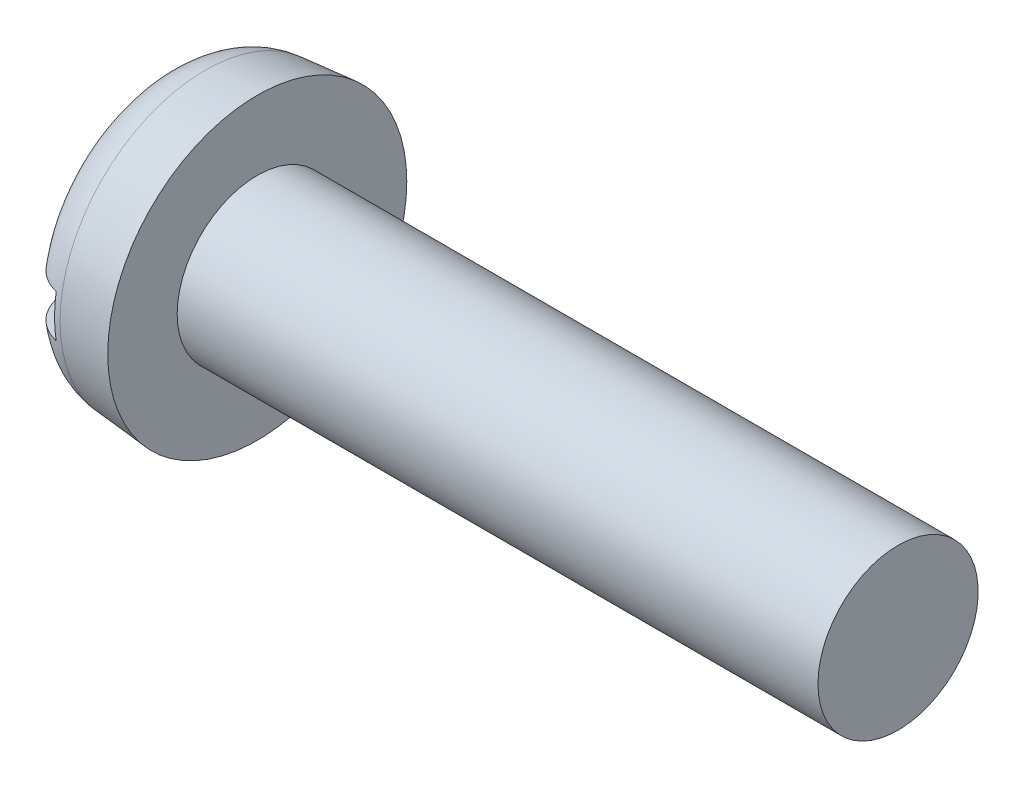
ISO-10303-21;
HEADER;
FILE_DESCRIPTION(('STEP AP214'),'2;1');
FILE_NAME('part.step','',(''),(''),'','','');
FILE_SCHEMA(('AUTOMOTIVE_DESIGN { 1 0 10303 214 1 1 1 1 }'));
ENDSEC;
DATA;
#1=APPLICATION_CONTEXT('core data for automotive mechanical design processes');
#2=APPLICATION_PROTOCOL_DEFINITION('international standard','automotive_design',2000,#1);
#3=PRODUCT_CONTEXT('',#1,'mechanical');
#4=PRODUCT('Part','Part','',(#3));
#5=PRODUCT_RELATED_PRODUCT_CATEGORY('part','',(#4));
#6=PRODUCT_DEFINITION_FORMATION('','',#4);
#7=PRODUCT_DEFINITION_CONTEXT('part definition',#1,'design');
#8=PRODUCT_DEFINITION('design','',#6,#7);
#9=PRODUCT_DEFINITION_SHAPE('','',#8);
#10=(LENGTH_UNIT() NAMED_UNIT(*) SI_UNIT(.MILLI.,.METRE.));
#11=(NAMED_UNIT(*) PLANE_ANGLE_UNIT() SI_UNIT($,.RADIAN.));
#12=(NAMED_UNIT(*) SI_UNIT($,.STERADIAN.) SOLID_ANGLE_UNIT());
#13=UNCERTAINTY_MEASURE_WITH_UNIT(LENGTH_MEASURE(1.E-05),#10,'distance_accuracy_value','');
#14=(GEOMETRIC_REPRESENTATION_CONTEXT(3) GLOBAL_UNCERTAINTY_ASSIGNED_CONTEXT((#13)) GLOBAL_UNIT_ASSIGNED_CONTEXT((#10,
#11,#12)) REPRESENTATION_CONTEXT('',''));
#15=CARTESIAN_POINT('',(0.,0.,0.));
#16=DIRECTION('',(0.,0.,1.));
#17=DIRECTION('',(1.,0.,0.));
#18=AXIS2_PLACEMENT_3D('',#15,#16,#17);
#19=CARTESIAN_POINT('',(0.,0.,0.));
#20=DIRECTION('',(-1.,0.,0.));
#21=DIRECTION('',(0.,0.,1.));
#22=AXIS2_PLACEMENT_3D('',#19,#20,#21);
#23=PLANE('',#22);
#24=DIRECTION('',(0.,0.,-1.));
#25=VECTOR('',#24,1.);
#26=CARTESIAN_POINT('',(0.,0.4,2.8));
#27=LINE('',#26,#25);
#28=CARTESIAN_POINT('',(0.,0.4,1.77326763142532));
#29=VERTEX_POINT('',#28);
#30=CARTESIAN_POINT('',(0.,0.4,-1.77326763142532));
#31=VERTEX_POINT('',#30);
#32=EDGE_CURVE('E88',#29,#31,#27,.T.);
#33=ORIENTED_EDGE('',*,*,#32,.F.);
#34=CARTESIAN_POINT('',(0.,0.,0.));
#35=DIRECTION('',(-1.,0.,0.));
#36=DIRECTION('',(0.,0.,1.));
#37=AXIS2_PLACEMENT_3D('',#34,#35,#36);
#38=CIRCLE('',#37,1.81782234903766);
#39=EDGE_CURVE('E94',#29,#31,#38,.T.);
#40=ORIENTED_EDGE('',*,*,#39,.T.);
#41=EDGE_LOOP('',(#33,#40));
#42=FACE_BOUND('',#41,.T.);
#43=ADVANCED_FACE('F35',(#42),#23,.T.);
#44=CARTESIAN_POINT('',(-25.4,0.,0.));
#45=DIRECTION('',(-1.,0.,0.));
#46=DIRECTION('',(0.,0.,1.));
#47=AXIS2_PLACEMENT_3D('',#44,#45,#46);
#48=CYLINDRICAL_SURFACE('',#47,1.5);
#49=CARTESIAN_POINT('',(13.8,0.,0.));
#50=DIRECTION('',(-1.,0.,0.));
#51=DIRECTION('',(0.,0.,1.));
#52=AXIS2_PLACEMENT_3D('',#49,#50,#51);
#53=CIRCLE('',#52,1.5);
#54=CARTESIAN_POINT('',(13.8,0.,1.5));
#55=VERTEX_POINT('',#54);
#56=EDGE_CURVE('E95',#55,#55,#53,.T.);
#57=ORIENTED_EDGE('',*,*,#56,.T.);
#58=EDGE_LOOP('',(#57));
#59=FACE_BOUND('',#58,.T.);
#60=CARTESIAN_POINT('',(1.8,0.,0.));
#61=DIRECTION('',(-1.,0.,0.));
#62=DIRECTION('',(0.,0.,1.));
#63=AXIS2_PLACEMENT_3D('',#60,#61,#62);
#64=CIRCLE('',#63,1.5);
#65=CARTESIAN_POINT('',(1.8,0.,1.5));
#66=VERTEX_POINT('',#65);
#67=EDGE_CURVE('E152',#66,#66,#64,.T.);
#68=ORIENTED_EDGE('',*,*,#67,.F.);
#69=EDGE_LOOP('',(#68));
#70=FACE_BOUND('',#69,.T.);
#71=ADVANCED_FACE('F140',(#59,#70),#48,.T.);
#72=CARTESIAN_POINT('',(13.8,1.5,0.));
#73=DIRECTION('',(1.,0.,0.));
#74=DIRECTION('',(0.,0.,-1.));
#75=AXIS2_PLACEMENT_3D('',#72,#73,#74);
#76=PLANE('',#75);
#77=ORIENTED_EDGE('',*,*,#56,.F.);
#78=EDGE_LOOP('',(#77));
#79=FACE_BOUND('',#78,.T.);
#80=ADVANCED_FACE('F138',(#79),#76,.T.);
#81=DIRECTION('',(0.,0.,1.));
#82=VECTOR('',#81,1.);
#83=CARTESIAN_POINT('',(0.,-0.4,-2.8));
#84=LINE('',#83,#82);
#85=CARTESIAN_POINT('',(0.,-0.4,-1.77326763142532));
#86=VERTEX_POINT('',#85);
#87=CARTESIAN_POINT('',(0.,-0.4,1.77326763142532));
#88=VERTEX_POINT('',#87);
#89=EDGE_CURVE('E79',#86,#88,#84,.T.);
#90=ORIENTED_EDGE('',*,*,#89,.F.);
#91=EDGE_CURVE('E86',#86,#88,#38,.T.);
#92=ORIENTED_EDGE('',*,*,#91,.T.);
#93=EDGE_LOOP('',(#90,#92));
#94=FACE_BOUND('',#93,.T.);
#95=ADVANCED_FACE('F85',(#94),#23,.T.);
#96=CARTESIAN_POINT('',(0.,0.,0.));
#97=DIRECTION('',(1.,0.,0.));
#98=DIRECTION('',(0.,0.,-1.));
#99=AXIS2_PLACEMENT_3D('',#96,#97,#98);
#100=CONICAL_SURFACE('',#99,2.64252040565334,0.0872664625997168);
#101=CARTESIAN_POINT('',(0.821559831527111,0.,0.));
#102=DIRECTION('',(-1.,0.,0.));
#103=DIRECTION('',(0.,0.,1.));
#104=AXIS2_PLACEMENT_3D('',#101,#102,#103);
#105=CIRCLE('',#104,2.71439757732023);
#106=CARTESIAN_POINT('',(0.821559831527111,0.,2.71439757732023));
#107=VERTEX_POINT('',#106);
#108=EDGE_CURVE('E98',#107,#107,#105,.F.);
#109=ORIENTED_EDGE('',*,*,#108,.T.);
#110=EDGE_LOOP('',(#109));
#111=FACE_BOUND('',#110,.T.);
#112=CARTESIAN_POINT('',(1.8,0.,0.));
#113=DIRECTION('',(-1.,0.,0.));
#114=DIRECTION('',(0.,0.,1.));
#115=AXIS2_PLACEMENT_3D('',#112,#113,#114);
#116=CIRCLE('',#115,2.8);
#117=CARTESIAN_POINT('',(1.8,0.,2.8));
#118=VERTEX_POINT('',#117);
#119=EDGE_CURVE('E100',#118,#118,#116,.T.);
#120=ORIENTED_EDGE('',*,*,#119,.T.);
#121=EDGE_LOOP('',(#120));
#122=FACE_BOUND('',#121,.T.);
#123=ADVANCED_FACE('F131',(#111,#122),#100,.T.);
#124=CARTESIAN_POINT('',(1.8,1.5,0.));
#125=DIRECTION('',(-1.,0.,0.));
#126=DIRECTION('',(0.,0.,1.));
#127=AXIS2_PLACEMENT_3D('',#124,#125,#126);
#128=PLANE('',#127);
#129=ORIENTED_EDGE('',*,*,#119,.F.);
#130=EDGE_LOOP('',(#129));
#131=FACE_BOUND('',#130,.T.);
#132=ORIENTED_EDGE('',*,*,#67,.T.);
#133=EDGE_LOOP('',(#132));
#134=FACE_BOUND('',#133,.T.);
#135=ADVANCED_FACE('F127',(#131,#134),#128,.F.);
#136=CARTESIAN_POINT('',(0.9,0.,0.));
#137=DIRECTION('',(-1.,0.,0.));
#138=DIRECTION('',(0.,0.,1.));
#139=AXIS2_PLACEMENT_3D('',#136,#137,#138);
#140=TOROIDAL_SURFACE('',#139,1.81782234903766,0.9);
#141=CARTESIAN_POINT('',(0.401696093511728,0.4,-2.53593152114129));
#142=CARTESIAN_POINT('',(0.443301117774009,0.4,-2.56393332788218));
#143=CARTESIAN_POINT('',(0.48728921147468,0.4,-2.58845843023252));
#144=CARTESIAN_POINT('',(0.578792425576941,0.4,-2.62980192456992));
#145=CARTESIAN_POINT('',(0.626311517541325,0.4,-2.64661148109401));
#146=CARTESIAN_POINT('',(0.723491694345221,0.4,-2.67199528317045));
#147=CARTESIAN_POINT('',(0.77315217005018,0.4,-2.6805718547261));
#148=CARTESIAN_POINT('',(0.873195470603058,0.4,-2.68923740018578));
#149=CARTESIAN_POINT('',(0.923578118909892,0.4,-2.68932841422142));
#150=CARTESIAN_POINT('',(1.02350797374872,0.4,-2.68103738118982));
#151=CARTESIAN_POINT('',(1.07305702227845,0.4,-2.67267751789981));
#152=CARTESIAN_POINT('',(1.17005159771854,0.4,-2.64776531442094));
#153=CARTESIAN_POINT('',(1.21749706154432,0.4,-2.63121272872072));
#154=CARTESIAN_POINT('',(1.30899463227735,0.4,-2.59038229907007));
#155=CARTESIAN_POINT('',(1.35304326494453,0.4,-2.5660966726896));
#156=CARTESIAN_POINT('',(1.43646971838795,0.4,-2.51051742624853));
#157=CARTESIAN_POINT('',(1.47584746170715,0.4,-2.47922368999777));
#158=CARTESIAN_POINT('',(1.54908472891299,0.4,-2.41032419236434));
#159=CARTESIAN_POINT('',(1.58290894495081,0.4,-2.37268091273685));
#160=CARTESIAN_POINT('',(1.64384285536696,0.4,-2.29230689336045));
#161=CARTESIAN_POINT('',(1.67095227126419,0.4,-2.24957594272072));
#162=CARTESIAN_POINT('',(1.71804431058735,0.4,-2.15971237578418));
#163=CARTESIAN_POINT('',(1.73793948776457,0.4,-2.11253395536871));
#164=CARTESIAN_POINT('',(1.76968090770725,0.4,-2.01554593245493));
#165=CARTESIAN_POINT('',(1.78152655521718,0.4,-1.96573613566218));
#166=CARTESIAN_POINT('',(1.79707863209083,0.4,-1.86394560462762));
#167=CARTESIAN_POINT('',(1.80063474217523,0.4,-1.81194193297292));
#168=CARTESIAN_POINT('',(1.79917918253395,0.4,-1.70805700113295));
#169=CARTESIAN_POINT('',(1.79416652473772,0.4,-1.65617575575555));
#170=CARTESIAN_POINT('',(1.7755943642346,0.4,-1.55269446133053));
#171=CARTESIAN_POINT('',(1.76183474132893,0.4,-1.50113034177219));
#172=CARTESIAN_POINT('',(1.72605722331735,0.4,-1.40095096381718));
#173=CARTESIAN_POINT('',(1.70403814128862,0.4,-1.35233613041373));
#174=CARTESIAN_POINT('',(1.65177086981811,0.4,-1.25824022538735));
#175=CARTESIAN_POINT('',(1.62134113345016,0.4,-1.21285988807693));
#176=CARTESIAN_POINT('',(1.55331109595649,0.4,-1.12780932458797));
#177=CARTESIAN_POINT('',(1.51570875984687,0.4,-1.08814072454133));
#178=CARTESIAN_POINT('',(1.43418773757712,0.4,-1.01571120097083));
#179=CARTESIAN_POINT('',(1.39025557046043,0.4,-0.982965398150426));
#180=CARTESIAN_POINT('',(1.29725173640542,0.4,-0.925820211344956));
#181=CARTESIAN_POINT('',(1.24818246394632,0.4,-0.901416961201436));
#182=CARTESIAN_POINT('',(1.1492196326343,0.4,-0.863395366502829));
#183=CARTESIAN_POINT('',(1.09953332116632,0.4,-0.849240526280142));
#184=CARTESIAN_POINT('',(0.998407326739823,0.4,-0.830450847570662));
#185=CARTESIAN_POINT('',(0.946969290105793,0.4,-0.825807308120568));
#186=CARTESIAN_POINT('',(0.84892872096548,0.4,-0.826338661096803));
#187=CARTESIAN_POINT('',(0.802319233875119,0.4,-0.830644672645143));
#188=CARTESIAN_POINT('',(0.710503550748047,0.4,-0.847082675101284));
#189=CARTESIAN_POINT('',(0.665297586491216,0.4,-0.859215951485934));
#190=CARTESIAN_POINT('',(0.577725921687515,0.4,-0.890561229701253));
#191=CARTESIAN_POINT('',(0.535345451357801,0.4,-0.909732336345551));
#192=CARTESIAN_POINT('',(0.454039585142496,0.4,-0.954356114786257));
#193=CARTESIAN_POINT('',(0.415115190169609,0.4,-0.979810598293163));
#194=CARTESIAN_POINT('',(0.338258283652574,0.4,-1.03863563377017));
#195=CARTESIAN_POINT('',(0.300704584388947,0.4,-1.07250127234658));
#196=CARTESIAN_POINT('',(0.231340396591253,0.4,-1.14567873524743));
#197=CARTESIAN_POINT('',(0.199531837361427,0.4,-1.1849923812911));
#198=CARTESIAN_POINT('',(0.140343537062657,0.4,-1.27100479329441));
#199=CARTESIAN_POINT('',(0.113435239263175,0.4,-1.31802904125808));
#200=CARTESIAN_POINT('',(0.0677697881199934,0.4,-1.41588613859262));
#201=CARTESIAN_POINT('',(0.0490135480549559,0.4,-1.466719413943));
#202=CARTESIAN_POINT('',(0.0200605085740848,0.4,-1.57150752749652));
#203=CARTESIAN_POINT('',(0.00998112078324489,0.4,-1.62549494001755));
#204=CARTESIAN_POINT('',(-0.000774459474645484,0.4,-1.73439964710515));
#205=CARTESIAN_POINT('',(-0.00145178031293717,0.4,-1.78931682929512));
#206=CARTESIAN_POINT('',(0.00665978805998371,0.4,-1.8973585349181));
#207=CARTESIAN_POINT('',(0.0152619165789972,0.4,-1.95049703954292));
#208=CARTESIAN_POINT('',(0.0415044362784365,0.4,-2.05451158025993));
#209=CARTESIAN_POINT('',(0.0591459771853456,0.4,-2.10538732765632));
#210=CARTESIAN_POINT('',(0.102479617855353,0.4,-2.20207106255329));
#211=CARTESIAN_POINT('',(0.127962009730159,0.4,-2.24797321246302));
#212=CARTESIAN_POINT('',(0.186405952526769,0.4,-2.3346826673761));
#213=CARTESIAN_POINT('',(0.219357119954585,0.4,-2.37549692488183));
#214=CARTESIAN_POINT('',(0.2776517991716,0.4,-2.43611780517026));
#215=CARTESIAN_POINT('',(0.300961246504243,0.4,-2.45791602542563));
#216=CARTESIAN_POINT('',(0.349758108963351,0.4,-2.49892172941219));
#217=CARTESIAN_POINT('',(0.375245501851939,0.4,-2.51812923959063));
#218=CARTESIAN_POINT('',(0.401696093511728,0.4,-2.53593152114129));
#219=B_SPLINE_CURVE_WITH_KNOTS('',3,(#141,#142,#143,#144,#145,#146,#147,#148,#149,#150,#151,
#152,#153,#154,#155,#156,#157,#158,#159,#160,#161,#162,#163,#164,#165,#166,#167,#168,#169,#170,
#171,#172,#173,#174,#175,#176,#177,#178,#179,#180,#181,#182,#183,#184,#185,#186,#187,#188,#189,
#190,#191,#192,#193,#194,#195,#196,#197,#198,#199,#200,#201,#202,#203,#204,#205,#206,#207,#208,
#209,#210,#211,#212,#213,#214,#215,#216,#217,#218),.UNSPECIFIED.,.T.,.F.,(4,2,2,2,2,2,2,2,2,2,2,
2,2,2,2,2,2,2,2,2,2,2,2,2,2,2,2,2,2,2,2,2,2,2,2,2,2,2,4),(0.,0.150335933494514,
0.300843597394242,0.451308726970357,0.601737681026104,0.751772777865598,0.901812371080131,
1.05200344195132,1.20219700308282,1.35331128753966,1.50443183806961,1.65732734739064,
1.81023416196794,1.96589285940572,2.1215695071664,2.28094272743601,2.44033885916066,
2.60348795607714,2.76668341009569,2.93023171311279,3.09370412047096,3.24783730341248,
3.40182942181944,3.5415702699926,3.68133407374162,3.82029827564248,3.95930259253055,
4.11036263383425,4.26147330942957,4.42325618279747,4.58505717610391,4.74901464634026,
4.9129524393615,5.07365129317271,5.23437059141101,5.39111839087745,5.54764959339694,
5.64322735248863,5.73880413580184),.UNSPECIFIED.);
#220=CARTESIAN_POINT('',(0.7,0.4,-2.66547244738019));
#221=VERTEX_POINT('',#220);
#222=EDGE_CURVE('E11',#31,#221,#219,.T.);
#223=ORIENTED_EDGE('',*,*,#222,.F.);
#224=ORIENTED_EDGE('',*,*,#39,.F.);
#225=CARTESIAN_POINT('',(0.631175220468883,0.4,0.871495981540627));
#226=CARTESIAN_POINT('',(0.674904543341188,0.4,0.856438796500031));
#227=CARTESIAN_POINT('',(0.719878263159747,0.4,0.844929838444239));
#228=CARTESIAN_POINT('',(0.811135722097473,0.4,0.829645582358335));
#229=CARTESIAN_POINT('',(0.857419653490011,0.4,0.82587142543657));
#230=CARTESIAN_POINT('',(0.949967657712768,0.4,0.826292946243278));
#231=CARTESIAN_POINT('',(0.996231718998188,0.4,0.830491246695725));
#232=CARTESIAN_POINT('',(1.08739120729822,0.4,0.846603737630664));
#233=CARTESIAN_POINT('',(1.13228633060722,0.4,0.858519627443414));
#234=CARTESIAN_POINT('',(1.21961165117638,0.4,0.889449471124122));
#235=CARTESIAN_POINT('',(1.26203829733493,0.4,0.908473372222466));
#236=CARTESIAN_POINT('',(1.34345634110222,0.4,0.952815473313927));
#237=CARTESIAN_POINT('',(1.38244667242382,0.4,0.978135617780085));
#238=CARTESIAN_POINT('',(1.4594377621541,0.4,1.03667706350997));
#239=CARTESIAN_POINT('',(1.49706398720202,0.4,1.07039108297028));
#240=CARTESIAN_POINT('',(1.56659895295035,0.4,1.14327535241885));
#241=CARTESIAN_POINT('',(1.59850581805068,0.4,1.18244738484377));
#242=CARTESIAN_POINT('',(1.65794109406934,0.4,1.26820361081833));
#243=CARTESIAN_POINT('',(1.68499616118368,0.4,1.31511693869777));
#244=CARTESIAN_POINT('',(1.73097615311023,0.4,1.41277630231542));
#245=CARTESIAN_POINT('',(1.74990014079754,0.4,1.46352277904048));
#246=CARTESIAN_POINT('',(1.77921631303595,0.4,1.56819037296415));
#247=CARTESIAN_POINT('',(1.78948692404479,0.4,1.62214568122431));
#248=CARTESIAN_POINT('',(1.80062989577949,0.4,1.73102148257415));
#249=CARTESIAN_POINT('',(1.80150300404476,0.4,1.78594189854469));
#250=CARTESIAN_POINT('',(1.79377570144154,0.4,1.89403950300678));
#251=CARTESIAN_POINT('',(1.78535947623962,0.4,1.94722981003804));
#252=CARTESIAN_POINT('',(1.75948035152466,0.4,2.05136420293336));
#253=CARTESIAN_POINT('',(1.74201866082191,0.4,2.10230858794919));
#254=CARTESIAN_POINT('',(1.69903294428936,0.4,2.1991365537311));
#255=CARTESIAN_POINT('',(1.67372338322898,0.4,2.24511537218269));
#256=CARTESIAN_POINT('',(1.61559302758182,0.4,2.33205182310155));
#257=CARTESIAN_POINT('',(1.58277310246186,0.4,2.37301003595672));
#258=CARTESIAN_POINT('',(1.51127974813898,0.4,2.44787841079591));
#259=CARTESIAN_POINT('',(1.47273752290481,0.4,2.48191390856888));
#260=CARTESIAN_POINT('',(1.39041996071933,0.4,2.54292499319193));
#261=CARTESIAN_POINT('',(1.34664504043414,0.4,2.5699011416151));
#262=CARTESIAN_POINT('',(1.25574182443869,0.4,2.61566191750627));
#263=CARTESIAN_POINT('',(1.20866632391598,0.4,2.63455146707593));
#264=CARTESIAN_POINT('',(1.11199802813735,0.4,2.66409285611721));
#265=CARTESIAN_POINT('',(1.06240535215686,0.4,2.67474508552361));
#266=CARTESIAN_POINT('',(0.962502526653357,0.4,2.68744471269732));
#267=CARTESIAN_POINT('',(0.912200346253432,0.4,2.68955487726819));
#268=CARTESIAN_POINT('',(0.811958811975336,0.4,2.68528081529453));
#269=CARTESIAN_POINT('',(0.762019450666034,0.4,2.67889676322146));
#270=CARTESIAN_POINT('',(0.664027531989639,0.4,2.65784627208927));
#271=CARTESIAN_POINT('',(0.615971279375599,0.4,2.643197022474));
#272=CARTESIAN_POINT('',(0.522990210676872,0.4,2.60606123058607));
#273=CARTESIAN_POINT('',(0.478065406672589,0.4,2.58357465808084));
#274=CARTESIAN_POINT('',(0.392472109536808,0.4,2.53134616302211));
#275=CARTESIAN_POINT('',(0.351816515703728,0.4,2.50158310815031));
#276=CARTESIAN_POINT('',(0.276029509997113,0.4,2.4357048513604));
#277=CARTESIAN_POINT('',(0.240898244430083,0.4,2.39958948126101));
#278=CARTESIAN_POINT('',(0.176835333350468,0.4,2.32172709740984));
#279=CARTESIAN_POINT('',(0.147956836829552,0.4,2.27993636985612));
#280=CARTESIAN_POINT('',(0.0975151321071609,0.4,2.19215427977415));
#281=CARTESIAN_POINT('',(0.0759523258739369,0.4,2.14616268660111));
#282=CARTESIAN_POINT('',(0.0404117526562702,0.4,2.05060031814039));
#283=CARTESIAN_POINT('',(0.0265449840419457,0.4,2.00098828619734));
#284=CARTESIAN_POINT('',(0.00715737687929584,0.4,1.90016214005584));
#285=CARTESIAN_POINT('',(0.00163730520276083,0.4,1.84894787909014));
#286=CARTESIAN_POINT('',(-0.00103646856464831,0.4,1.74525626284435));
#287=CARTESIAN_POINT('',(0.00198298502720431,0.4,1.692774471539));
#288=CARTESIAN_POINT('',(0.0165672576861163,0.4,1.5890162459782));
#289=CARTESIAN_POINT('',(0.0281327748436754,0.4,1.53773991054426));
#290=CARTESIAN_POINT('',(0.0597928723844844,0.4,1.43649219995258));
#291=CARTESIAN_POINT('',(0.0800919231210289,0.4,1.3865847552086));
#292=CARTESIAN_POINT('',(0.128628670781471,0.4,1.29076759544655));
#293=CARTESIAN_POINT('',(0.156870001205797,0.4,1.2448597228063));
#294=CARTESIAN_POINT('',(0.221149361739103,0.4,1.15746425330815));
#295=CARTESIAN_POINT('',(0.257329693538453,0.4,1.11608124200677));
#296=CARTESIAN_POINT('',(0.33619903186313,0.4,1.04011285475969));
#297=CARTESIAN_POINT('',(0.378880772489415,0.4,1.00551998779309));
#298=CARTESIAN_POINT('',(0.456345744826249,0.4,0.953377181098868));
#299=CARTESIAN_POINT('',(0.489781510585734,0.4,0.933802963989649));
#300=CARTESIAN_POINT('',(0.558913558209207,0.4,0.899158166013482));
#301=CARTESIAN_POINT('',(0.594609343085406,0.4,0.884086599134742));
#302=CARTESIAN_POINT('',(0.631175220468883,0.4,0.871495981540627));
#303=B_SPLINE_CURVE_WITH_KNOTS('',3,(#225,#226,#227,#228,#229,#230,#231,#232,#233,#234,#235,
#236,#237,#238,#239,#240,#241,#242,#243,#244,#245,#246,#247,#248,#249,#250,#251,#252,#253,#254,
#255,#256,#257,#258,#259,#260,#261,#262,#263,#264,#265,#266,#267,#268,#269,#270,#271,#272,#273,
#274,#275,#276,#277,#278,#279,#280,#281,#282,#283,#284,#285,#286,#287,#288,#289,#290,#291,#292,
#293,#294,#295,#296,#297,#298,#299,#300,#301,#302),.UNSPECIFIED.,.T.,.F.,(4,2,2,2,2,2,2,2,2,2,2,
2,2,2,2,2,2,2,2,2,2,2,2,2,2,2,2,2,2,2,2,2,2,2,2,2,2,2,4),(0.,0.138615612916103,
0.277251674198893,0.415933350916858,0.554645574236207,0.693552648422647,0.832502674767945,
0.983421485118331,1.13438969741741,1.29610427307938,1.45783748170807,1.62180673071881,
1.78576293643649,1.94652574714201,2.10726707950299,2.2639540446038,2.42062287939072,
2.57413636036031,2.72763762557716,2.87908198292273,3.03051917082038,3.18084156107108,
3.33116086374289,3.4811686879926,3.63117709090574,3.78162643331956,3.93207975956823,
4.08376569017546,4.23545995397545,4.38928870771081,4.54313159395465,4.70011617891189,
4.85711358867004,5.01800577434983,5.17897168640495,5.34310060642745,5.50704742574204,
5.62298136153755,5.73888989092701),.UNSPECIFIED.);
#304=CARTESIAN_POINT('',(0.7,0.4,2.66547244738019));
#305=VERTEX_POINT('',#304);
#306=EDGE_CURVE('E112',#305,#29,#303,.T.);
#307=ORIENTED_EDGE('',*,*,#306,.F.);
#308=CARTESIAN_POINT('',(0.7,0.,0.));
#309=DIRECTION('',(-1.,0.,0.));
#310=DIRECTION('',(0.,0.,1.));
#311=AXIS2_PLACEMENT_3D('',#308,#309,#310);
#312=CIRCLE('',#311,2.69531878777687);
#313=CARTESIAN_POINT('',(0.7,-0.4,2.66547244738019));
#314=VERTEX_POINT('',#313);
#315=EDGE_CURVE('E106',#305,#314,#312,.F.);
#316=ORIENTED_EDGE('',*,*,#315,.T.);
#317=CARTESIAN_POINT('',(0.631175220468883,-0.4,0.871495981540627));
#318=CARTESIAN_POINT('',(0.582440056051627,-0.4,0.888281741940888));
#319=CARTESIAN_POINT('',(0.535174963055644,-0.4,0.909503716497946));
#320=CARTESIAN_POINT('',(0.444903467512748,-0.4,0.959728629210835));
#321=CARTESIAN_POINT('',(0.401907569369314,-0.4,0.988750138784298));
#322=CARTESIAN_POINT('',(0.32139933187422,-0.4,1.05330679583531));
#323=CARTESIAN_POINT('',(0.283866824101226,-0.4,1.08881683540862));
#324=CARTESIAN_POINT('',(0.214947035166147,-0.4,1.16532583126717));
#325=CARTESIAN_POINT('',(0.183557026279774,-0.4,1.20632233747312));
#326=CARTESIAN_POINT('',(0.126173306630207,-0.4,1.29499806178717));
#327=CARTESIAN_POINT('',(0.100543812186154,-0.4,1.34291357063032));
#328=CARTESIAN_POINT('',(0.0575990442880277,-0.4,1.44234685085245));
#329=CARTESIAN_POINT('',(0.0402853165841816,-0.4,1.4938652899135));
#330=CARTESIAN_POINT('',(0.0144295468099868,-0.4,1.59957722380881));
#331=CARTESIAN_POINT('',(0.00597091020770669,-0.4,1.65379120331088));
#332=CARTESIAN_POINT('',(-0.00151505119498231,-0.4,1.76286943896087));
#333=CARTESIAN_POINT('',(-0.000543260661566268,-0.4,1.81773363362998));
#334=CARTESIAN_POINT('',(0.0108063117868816,-0.4,1.92531903415647));
#335=CARTESIAN_POINT('',(0.0209864254781905,-0.4,1.97806105250491));
#336=CARTESIAN_POINT('',(0.0502872770681116,-0.4,2.08100191154855));
#337=CARTESIAN_POINT('',(0.0694067748926924,-0.4,2.13120110391516));
#338=CARTESIAN_POINT('',(0.115513806824551,-0.4,2.22629801812597));
#339=CARTESIAN_POINT('',(0.14229288611334,-0.4,2.27129684027619));
#340=CARTESIAN_POINT('',(0.203167661896693,-0.4,2.35603997582291));
#341=CARTESIAN_POINT('',(0.237262555060448,-0.4,2.39578486536653));
#342=CARTESIAN_POINT('',(0.31107215015185,-0.4,2.46808210682477));
#343=CARTESIAN_POINT('',(0.350664393955093,-0.4,2.50075952492731));
#344=CARTESIAN_POINT('',(0.43483240572609,-0.4,2.55890052234819));
#345=CARTESIAN_POINT('',(0.479407789016665,-0.4,2.5843646579657));
#346=CARTESIAN_POINT('',(0.571659032279254,-0.4,2.62702917155574));
#347=CARTESIAN_POINT('',(0.61928802255602,-0.4,2.64433093880064));
#348=CARTESIAN_POINT('',(0.716785744822632,-0.4,2.67063086398603));
#349=CARTESIAN_POINT('',(0.766654377625563,-0.4,2.67962938927216));
#350=CARTESIAN_POINT('',(0.866851086765478,-0.4,2.68902063968356));
#351=CARTESIAN_POINT('',(0.917173710289189,-0.4,2.68947163706794));
#352=CARTESIAN_POINT('',(1.01717730229027,-0.4,2.68190382365889));
#353=CARTESIAN_POINT('',(1.06685828235616,-0.4,2.67388516605054));
#354=CARTESIAN_POINT('',(1.16408913364714,-0.4,2.64963561785688));
#355=CARTESIAN_POINT('',(1.21164224901621,-0.4,2.63341772685543));
#356=CARTESIAN_POINT('',(1.30336357324319,-0.4,2.5932548985632));
#357=CARTESIAN_POINT('',(1.34753176252252,-0.4,2.56930991658271));
#358=CARTESIAN_POINT('',(1.43140121230963,-0.4,2.51429882511239));
#359=CARTESIAN_POINT('',(1.47108662202344,-0.4,2.48320855787322));
#360=CARTESIAN_POINT('',(1.54472936336671,-0.4,2.41485918396244));
#361=CARTESIAN_POINT('',(1.57868652408327,-0.4,2.37759989329229));
#362=CARTESIAN_POINT('',(1.64024044205203,-0.4,2.29763356977095));
#363=CARTESIAN_POINT('',(1.66777905671271,-0.4,2.2548817982485));
#364=CARTESIAN_POINT('',(1.71540533966796,-0.4,2.16541487025925));
#365=CARTESIAN_POINT('',(1.73549258796614,-0.4,2.11869949056591));
#366=CARTESIAN_POINT('',(1.76797944190081,-0.4,2.02190542768205));
#367=CARTESIAN_POINT('',(1.78026184844694,-0.4,1.97178743470805));
#368=CARTESIAN_POINT('',(1.79642443017794,-0.4,1.87021727726405));
#369=CARTESIAN_POINT('',(1.80030382576996,-0.4,1.81876498945237));
#370=CARTESIAN_POINT('',(1.79965225810416,-0.4,1.71483495243173));
#371=CARTESIAN_POINT('',(1.79494304519989,-0.4,1.66235834857244));
#372=CARTESIAN_POINT('',(1.77700429154566,-0.4,1.55888409709202));
#373=CARTESIAN_POINT('',(1.76377367047763,-0.4,1.50788663784912));
#374=CARTESIAN_POINT('',(1.72880303252309,-0.4,1.40746214507163));
#375=CARTESIAN_POINT('',(1.7068583172022,-0.4,1.35810636780321));
#376=CARTESIAN_POINT('',(1.6551362081094,-0.4,1.2636760290119));
#377=CARTESIAN_POINT('',(1.62535713115486,-0.4,1.21860239032601));
#378=CARTESIAN_POINT('',(1.55817582249343,-0.4,1.13325277423327));
#379=CARTESIAN_POINT('',(1.52065002148733,-0.4,1.09307386688499));
#380=CARTESIAN_POINT('',(1.43925099604233,-0.4,1.01972901550195));
#381=CARTESIAN_POINT('',(1.39537733695676,-0.4,0.986563552070545));
#382=CARTESIAN_POINT('',(1.30343025383384,-0.4,0.929222350042134));
#383=CARTESIAN_POINT('',(1.25547156560025,-0.4,0.904863533629853));
#384=CARTESIAN_POINT('',(1.15587516450286,-0.4,0.865408006374134));
#385=CARTESIAN_POINT('',(1.10423998181313,-0.4,0.850304993129927));
#386=CARTESIAN_POINT('',(1.00351728354306,-0.4,0.831235729727251));
#387=CARTESIAN_POINT('',(0.954588162116058,-0.4,0.826429393731615));
#388=CARTESIAN_POINT('',(0.856720563885967,-0.4,0.825757597618513));
#389=CARTESIAN_POINT('',(0.80778225521716,-0.4,0.8298764112406));
#390=CARTESIAN_POINT('',(0.737839755845568,-0.4,0.842103164129609));
#391=CARTESIAN_POINT('',(0.716186869313665,-0.4,0.846800488735406));
#392=CARTESIAN_POINT('',(0.673323995455611,-0.4,0.857891117601622));
#393=CARTESIAN_POINT('',(0.652113925657395,-0.4,0.86428410295996));
#394=CARTESIAN_POINT('',(0.631175220468883,-0.4,0.871495981540627));
#395=B_SPLINE_CURVE_WITH_KNOTS('',3,(#317,#318,#319,#320,#321,#322,#323,#324,#325,#326,#327,
#328,#329,#330,#331,#332,#333,#334,#335,#336,#337,#338,#339,#340,#341,#342,#343,#344,#345,#346,
#347,#348,#349,#350,#351,#352,#353,#354,#355,#356,#357,#358,#359,#360,#361,#362,#363,#364,#365,
#366,#367,#368,#369,#370,#371,#372,#373,#374,#375,#376,#377,#378,#379,#380,#381,#382,#383,#384,
#385,#386,#387,#388,#389,#390,#391,#392,#393,#394),.UNSPECIFIED.,.T.,.F.,(4,2,2,2,2,2,2,2,2,2,2,
2,2,2,2,2,2,2,2,2,2,2,2,2,2,2,2,2,2,2,2,2,2,2,2,2,2,2,4),(0.,0.154545929505514,
0.309463158544145,0.463793151236126,0.618054453677577,0.780314715588444,0.942605127077751,
1.10641075199289,1.27020101048904,1.43055663497239,1.59089002147255,1.74721863073234,
1.90353008272413,2.05679554725431,2.2100491885017,2.3613455070347,2.51263513171131,
2.66289297461213,2.81314809994484,2.96316574487772,3.11318425745476,3.26371763526343,
3.41425550371989,3.56610818035137,3.71796941486144,3.87206025933959,4.02616539904814,
4.18350533199931,4.3408652159535,4.50216376271748,4.66349699219782,4.82763600715278,
4.99178626625811,5.15229563882414,5.31269559661531,5.45941323508264,5.6058725648985,
5.67228456882568,5.73868409152545),.UNSPECIFIED.);
#396=EDGE_CURVE('E93',#88,#314,#395,.T.);
#397=ORIENTED_EDGE('',*,*,#396,.F.);
#398=ORIENTED_EDGE('',*,*,#91,.F.);
#399=CARTESIAN_POINT('',(0.401696093511728,-0.4,-2.53593152114129));
#400=CARTESIAN_POINT('',(0.359499569861718,-0.4,-2.50752594853869));
#401=CARTESIAN_POINT('',(0.319690458635452,-0.4,-2.47549983982046));
#402=CARTESIAN_POINT('',(0.246006645656666,-0.4,-2.40516587836491));
#403=CARTESIAN_POINT('',(0.212140132740978,-0.4,-2.36684949616946));
#404=CARTESIAN_POINT('',(0.151336229791143,-0.4,-2.28512812362888));
#405=CARTESIAN_POINT('',(0.124391330893495,-0.4,-2.24172872264131));
#406=CARTESIAN_POINT('',(0.0780875903765085,-0.4,-2.15107708021563));
#407=CARTESIAN_POINT('',(0.0587267801703001,-0.4,-2.10382584244335));
#408=CARTESIAN_POINT('',(0.0278574989581019,-0.4,-2.00623443962711));
#409=CARTESIAN_POINT('',(0.016440901453291,-0.4,-1.95586524023863));
#410=CARTESIAN_POINT('',(0.00203581031766626,-0.4,-1.85393618870856));
#411=CARTESIAN_POINT('',(-0.000951523403916868,-0.4,-1.80237617368877));
#412=CARTESIAN_POINT('',(0.00150541182221353,-0.4,-1.69835894015113));
#413=CARTESIAN_POINT('',(0.00713078743956859,-0.4,-1.64590602749594));
#414=CARTESIAN_POINT('',(0.0268851706508874,-0.4,-1.54262865024755));
#415=CARTESIAN_POINT('',(0.0410152341853257,-0.4,-1.49180438869281));
#416=CARTESIAN_POINT('',(0.0777693985439923,-0.4,-1.39187524119994));
#417=CARTESIAN_POINT('',(0.100597428420281,-0.4,-1.34284532896703));
#418=CARTESIAN_POINT('',(0.154028665500749,-0.4,-1.24921236961778));
#419=CARTESIAN_POINT('',(0.184633577370676,-0.4,-1.20461029605316));
#420=CARTESIAN_POINT('',(0.253369835088766,-0.4,-1.12040413132917));
#421=CARTESIAN_POINT('',(0.291615661801268,-0.4,-1.08089328983157));
#422=CARTESIAN_POINT('',(0.374350758887981,-0.4,-1.00902344925026));
#423=CARTESIAN_POINT('',(0.418840522733276,-0.4,-0.976665015956932));
#424=CARTESIAN_POINT('',(0.511731904475918,-0.4,-0.921153761550259));
#425=CARTESIAN_POINT('',(0.56000602416032,-0.4,-0.897788688316841));
#426=CARTESIAN_POINT('',(0.660033558527157,-0.4,-0.860397113393027));
#427=CARTESIAN_POINT('',(0.711783369409339,-0.4,-0.846361098476873));
#428=CARTESIAN_POINT('',(0.812389224940536,-0.4,-0.829368295388297));
#429=CARTESIAN_POINT('',(0.861099258735353,-0.4,-0.825545352440831));
#430=CARTESIAN_POINT('',(0.958405899151309,-0.4,-0.826719597327248));
#431=CARTESIAN_POINT('',(1.00700253299767,-0.4,-0.831714388722303));
#432=CARTESIAN_POINT('',(1.0996760197852,-0.4,-0.84962330141339));
#433=CARTESIAN_POINT('',(1.14384950549969,-0.4,-0.862046867571478));
#434=CARTESIAN_POINT('',(1.22966211525765,-0.4,-0.89374221784771));
#435=CARTESIAN_POINT('',(1.27130051154861,-0.4,-0.913015957700824));
#436=CARTESIAN_POINT('',(1.35338723347829,-0.4,-0.958876506944367));
#437=CARTESIAN_POINT('',(1.39364158740159,-0.4,-0.985809526360112));
#438=CARTESIAN_POINT('',(1.46954671268381,-0.4,-1.04552244383327));
#439=CARTESIAN_POINT('',(1.50519595694897,-0.4,-1.07830427286891));
#440=CARTESIAN_POINT('',(1.5741481223088,-0.4,-1.15198864954587));
#441=CARTESIAN_POINT('',(1.60695638421133,-0.4,-1.19335517911256));
#442=CARTESIAN_POINT('',(1.66548530867698,-0.4,-1.28083525691765));
#443=CARTESIAN_POINT('',(1.69120428590284,-0.4,-1.32694993036066));
#444=CARTESIAN_POINT('',(1.73572700911521,-0.4,-1.42462801939109));
#445=CARTESIAN_POINT('',(1.75421770319601,-0.4,-1.47633466387386));
#446=CARTESIAN_POINT('',(1.78217546204147,-0.4,-1.58213636524115));
#447=CARTESIAN_POINT('',(1.79164262802123,-0.4,-1.63623139532851));
#448=CARTESIAN_POINT('',(1.80111834789599,-0.4,-1.74478524431538));
#449=CARTESIAN_POINT('',(1.80120671421375,-0.4,-1.79923704907971));
#450=CARTESIAN_POINT('',(1.79199564422116,-0.4,-1.90734333327446));
#451=CARTESIAN_POINT('',(1.78269735807886,-0.4,-1.96099790957378));
#452=CARTESIAN_POINT('',(1.75522804290983,-0.4,-2.06455754692508));
#453=CARTESIAN_POINT('',(1.73728348499548,-0.4,-2.11452267850709));
#454=CARTESIAN_POINT('',(1.69306568307316,-0.4,-2.21062233517153));
#455=CARTESIAN_POINT('',(1.66679349701772,-0.4,-2.25675734589841));
#456=CARTESIAN_POINT('',(1.60733395224623,-0.4,-2.34276585756036));
#457=CARTESIAN_POINT('',(1.57431956056638,-0.4,-2.38275897803032));
#458=CARTESIAN_POINT('',(1.50194333073533,-0.4,-2.45651788071981));
#459=CARTESIAN_POINT('',(1.46258208977932,-0.4,-2.49028424819412));
#460=CARTESIAN_POINT('',(1.37933549559489,-0.4,-2.55005790908044));
#461=CARTESIAN_POINT('',(1.33553510744259,-0.4,-2.57618357878773));
#462=CARTESIAN_POINT('',(1.24413819843943,-0.4,-2.62062313067504));
#463=CARTESIAN_POINT('',(1.19654207131845,-0.4,-2.63893782183569));
#464=CARTESIAN_POINT('',(1.09942378961358,-0.4,-2.66705979300267));
#465=CARTESIAN_POINT('',(1.0499260157382,-0.4,-2.67695133394454));
#466=CARTESIAN_POINT('',(0.949957006468675,-0.4,-2.68824503862299));
#467=CARTESIAN_POINT('',(0.899485546015457,-0.4,-2.6896452154879));
#468=CARTESIAN_POINT('',(0.799232995516733,-0.4,-2.68392343190627));
#469=CARTESIAN_POINT('',(0.749449974424365,-0.4,-2.67683486710842));
#470=CARTESIAN_POINT('',(0.651826495741724,-0.4,-2.65440372943721));
#471=CARTESIAN_POINT('',(0.603983614927445,-0.4,-2.63907181676455));
#472=CARTESIAN_POINT('',(0.530466612644572,-0.4,-2.60850240808469));
#473=CARTESIAN_POINT('',(0.503717386474933,-0.4,-2.59578274416443));
#474=CARTESIAN_POINT('',(0.45160806054978,-0.4,-2.56776112348693));
#475=CARTESIAN_POINT('',(0.426247954611343,-0.4,-2.55245917822458));
#476=CARTESIAN_POINT('',(0.401696093511728,-0.4,-2.53593152114129));
#477=B_SPLINE_CURVE_WITH_KNOTS('',3,(#399,#400,#401,#402,#403,#404,#405,#406,#407,#408,#409,
#410,#411,#412,#413,#414,#415,#416,#417,#418,#419,#420,#421,#422,#423,#424,#425,#426,#427,#428,
#429,#430,#431,#432,#433,#434,#435,#436,#437,#438,#439,#440,#441,#442,#443,#444,#445,#446,#447,
#448,#449,#450,#451,#452,#453,#454,#455,#456,#457,#458,#459,#460,#461,#462,#463,#464,#465,#466,
#467,#468,#469,#470,#471,#472,#473,#474,#475,#476),.UNSPECIFIED.,.T.,.F.,(4,2,2,2,2,2,2,2,2,2,2,
2,2,2,2,2,2,2,2,2,2,2,2,2,2,2,2,2,2,2,2,2,2,2,2,2,2,2,4),(0.,0.152490218607282,
0.305188944540641,0.457721310022948,0.610214056704589,0.764442291671228,0.91869174818651,
1.07622956938612,1.23378695448846,1.39529155818188,1.55683159371206,1.72100303477019,
1.88518745794618,2.0452166605768,2.2050824234249,2.3508822697905,2.49664249751799,
2.63370136587138,2.77079939621414,2.91549848817681,3.06024544108867,3.21793237831143,
3.37565677021802,3.539607260158,3.70355591107663,3.86610926645174,4.02864270620865,
4.18713298434998,4.34560313574806,4.5004280819907,4.65523846875457,4.80750509346896,
4.95975594414436,5.11046523737449,5.26120979331062,5.41136324663485,5.5613229886773,
5.65004914448151,5.73877490533682),.UNSPECIFIED.);
#478=CARTESIAN_POINT('',(0.7,-0.4,-2.66547244738019));
#479=VERTEX_POINT('',#478);
#480=EDGE_CURVE('E47',#479,#86,#477,.T.);
#481=ORIENTED_EDGE('',*,*,#480,.F.);
#482=EDGE_CURVE('E59',#479,#221,#312,.F.);
#483=ORIENTED_EDGE('',*,*,#482,.T.);
#484=EDGE_LOOP('',(#223,#224,#307,#316,#397,#398,#481,#483));
#485=FACE_BOUND('',#484,.T.);
#486=ORIENTED_EDGE('',*,*,#108,.F.);
#487=EDGE_LOOP('',(#486));
#488=FACE_BOUND('',#487,.T.);
#489=ADVANCED_FACE('F37',(#485,#488),#140,.T.);
#490=CARTESIAN_POINT('',(0.7,0.4,2.8));
#491=DIRECTION('',(0.,1.,0.));
#492=DIRECTION('',(0.,0.,1.));
#493=AXIS2_PLACEMENT_3D('',#490,#491,#492);
#494=PLANE('',#493);
#495=ORIENTED_EDGE('',*,*,#222,.T.);
#496=DIRECTION('',(0.,0.,-1.));
#497=VECTOR('',#496,1.);
#498=CARTESIAN_POINT('',(0.7,0.4,2.8));
#499=LINE('',#498,#497);
#500=EDGE_CURVE('E87',#305,#221,#499,.T.);
#501=ORIENTED_EDGE('',*,*,#500,.F.);
#502=ORIENTED_EDGE('',*,*,#306,.T.);
#503=ORIENTED_EDGE('',*,*,#32,.T.);
#504=EDGE_LOOP('',(#495,#501,#502,#503));
#505=FACE_BOUND('',#504,.T.);
#506=ADVANCED_FACE('F119',(#505),#494,.F.);
#507=CARTESIAN_POINT('',(0.7,-0.4,-2.8));
#508=DIRECTION('',(0.,-1.,0.));
#509=DIRECTION('',(0.,0.,-1.));
#510=AXIS2_PLACEMENT_3D('',#507,#508,#509);
#511=PLANE('',#510);
#512=ORIENTED_EDGE('',*,*,#480,.T.);
#513=ORIENTED_EDGE('',*,*,#89,.T.);
#514=ORIENTED_EDGE('',*,*,#396,.T.);
#515=DIRECTION('',(0.,0.,1.));
#516=VECTOR('',#515,1.);
#517=CARTESIAN_POINT('',(0.7,-0.4,-2.8));
#518=LINE('',#517,#516);
#519=EDGE_CURVE('E54',#479,#314,#518,.T.);
#520=ORIENTED_EDGE('',*,*,#519,.F.);
#521=EDGE_LOOP('',(#512,#513,#514,#520));
#522=FACE_BOUND('',#521,.T.);
#523=ADVANCED_FACE('F78',(#522),#511,.F.);
#524=CARTESIAN_POINT('',(0.7,0.4,-2.8));
#525=DIRECTION('',(-1.,0.,0.));
#526=DIRECTION('',(0.,0.,1.));
#527=AXIS2_PLACEMENT_3D('',#524,#525,#526);
#528=PLANE('',#527);
#529=ORIENTED_EDGE('',*,*,#519,.T.);
#530=ORIENTED_EDGE('',*,*,#315,.F.);
#531=ORIENTED_EDGE('',*,*,#500,.T.);
#532=ORIENTED_EDGE('',*,*,#482,.F.);
#533=EDGE_LOOP('',(#529,#530,#531,#532));
#534=FACE_BOUND('',#533,.T.);
#535=ADVANCED_FACE('F118',(#534),#528,.T.);
#536=CLOSED_SHELL('',(#43,#71,#80,#95,#123,#135,#489,#506,#523,#535));
#537=MANIFOLD_SOLID_BREP('B2',#536);
#538=ADVANCED_BREP_SHAPE_REPRESENTATION('',(#18,#537),#14);
#539=SHAPE_DEFINITION_REPRESENTATION(#9,#538);
ENDSEC;
END-ISO-10303-21;
